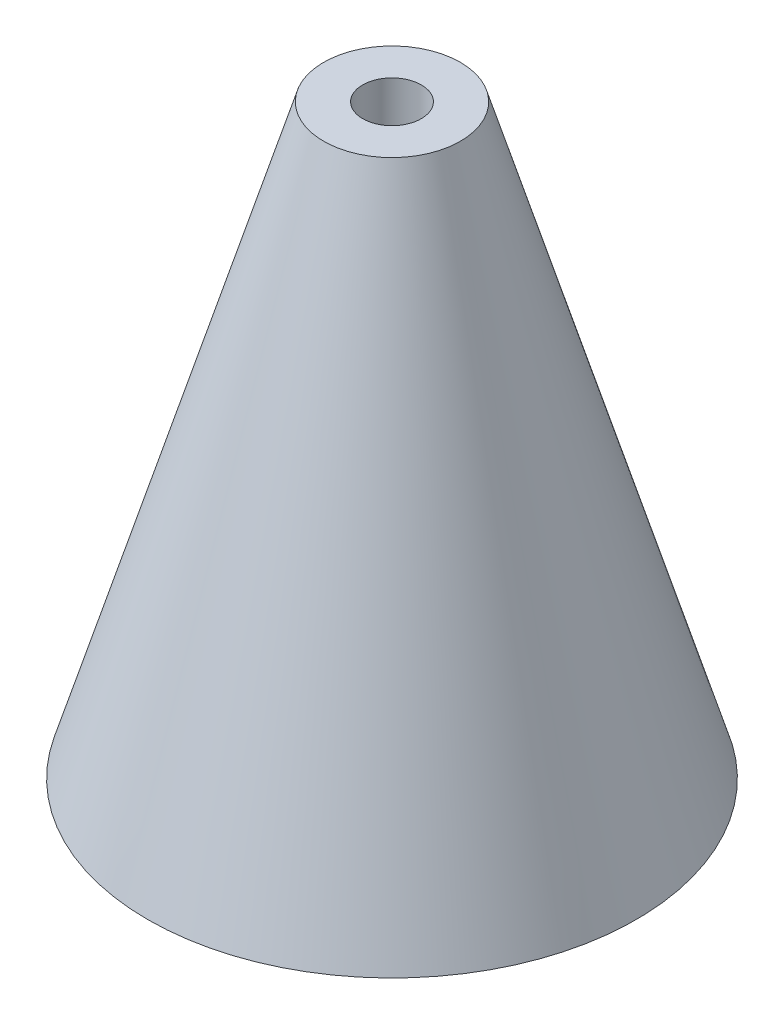
ISO-10303-21;
HEADER;
FILE_DESCRIPTION(('STEP AP214'),'2;1');
FILE_NAME('part.step','',(''),(''),'','','');
FILE_SCHEMA(('AUTOMOTIVE_DESIGN { 1 0 10303 214 1 1 1 1 }'));
ENDSEC;
DATA;
#1=APPLICATION_CONTEXT('core data for automotive mechanical design processes');
#2=APPLICATION_PROTOCOL_DEFINITION('international standard','automotive_design',2000,#1);
#3=PRODUCT_CONTEXT('',#1,'mechanical');
#4=PRODUCT('Part','Part','',(#3));
#5=PRODUCT_RELATED_PRODUCT_CATEGORY('part','',(#4));
#6=PRODUCT_DEFINITION_FORMATION('','',#4);
#7=PRODUCT_DEFINITION_CONTEXT('part definition',#1,'design');
#8=PRODUCT_DEFINITION('design','',#6,#7);
#9=PRODUCT_DEFINITION_SHAPE('','',#8);
#10=(LENGTH_UNIT() NAMED_UNIT(*) SI_UNIT(.MILLI.,.METRE.));
#11=(NAMED_UNIT(*) PLANE_ANGLE_UNIT() SI_UNIT($,.RADIAN.));
#12=(NAMED_UNIT(*) SI_UNIT($,.STERADIAN.) SOLID_ANGLE_UNIT());
#13=UNCERTAINTY_MEASURE_WITH_UNIT(LENGTH_MEASURE(1.E-05),#10,'distance_accuracy_value','');
#14=(GEOMETRIC_REPRESENTATION_CONTEXT(3) GLOBAL_UNCERTAINTY_ASSIGNED_CONTEXT((#13)) GLOBAL_UNIT_ASSIGNED_CONTEXT((#10,
#11,#12)) REPRESENTATION_CONTEXT('',''));
#15=CARTESIAN_POINT('',(0.,0.,0.));
#16=DIRECTION('',(0.,0.,1.));
#17=DIRECTION('',(1.,0.,0.));
#18=AXIS2_PLACEMENT_3D('',#15,#16,#17);
#19=CARTESIAN_POINT('',(3.,60.,0.));
#20=DIRECTION('',(0.,-1.,0.));
#21=DIRECTION('',(0.,0.,-1.));
#22=AXIS2_PLACEMENT_3D('',#19,#20,#21);
#23=PLANE('',#22);
#24=CARTESIAN_POINT('',(0.,60.,0.));
#25=DIRECTION('',(0.,1.,0.));
#26=DIRECTION('',(0.,0.,1.));
#27=AXIS2_PLACEMENT_3D('',#24,#25,#26);
#28=CIRCLE('',#27,3.);
#29=CARTESIAN_POINT('',(0.,60.,3.));
#30=VERTEX_POINT('',#29);
#31=EDGE_CURVE('E47',#30,#30,#28,.T.);
#32=ORIENTED_EDGE('',*,*,#31,.F.);
#33=EDGE_LOOP('',(#32));
#34=FACE_BOUND('',#33,.T.);
#35=CARTESIAN_POINT('',(0.,60.,0.));
#36=DIRECTION('',(0.,1.,0.));
#37=DIRECTION('',(0.,0.,1.));
#38=AXIS2_PLACEMENT_3D('',#35,#36,#37);
#39=CIRCLE('',#38,7.);
#40=CARTESIAN_POINT('',(0.,60.,-7.));
#41=VERTEX_POINT('',#40);
#42=EDGE_CURVE('E10',#41,#41,#39,.T.);
#43=ORIENTED_EDGE('',*,*,#42,.T.);
#44=EDGE_LOOP('',(#43));
#45=FACE_BOUND('',#44,.T.);
#46=ADVANCED_FACE('F33',(#34,#45),#23,.F.);
#47=CARTESIAN_POINT('',(0.,0.,0.));
#48=DIRECTION('',(0.,-1.,0.));
#49=DIRECTION('',(0.,0.,-1.));
#50=AXIS2_PLACEMENT_3D('',#47,#48,#49);
#51=CONICAL_SURFACE('',#50,25.,0.291456794477867);
#52=CARTESIAN_POINT('',(0.,0.,0.));
#53=DIRECTION('',(0.,1.,0.));
#54=DIRECTION('',(0.,0.,1.));
#55=AXIS2_PLACEMENT_3D('',#52,#53,#54);
#56=CIRCLE('',#55,25.);
#57=CARTESIAN_POINT('',(0.,0.,-25.));
#58=VERTEX_POINT('',#57);
#59=EDGE_CURVE('E39',#58,#58,#56,.T.);
#60=CARTESIAN_POINT('',(0.,60.,-7.));
#61=CARTESIAN_POINT('',(0.,59.375,-7.1875));
#62=CARTESIAN_POINT('',(0.,58.75,-7.375));
#63=CARTESIAN_POINT('',(0.,57.5,-7.75));
#64=CARTESIAN_POINT('',(0.,56.875,-7.9375));
#65=CARTESIAN_POINT('',(0.,55.625,-8.3125));
#66=CARTESIAN_POINT('',(0.,55.,-8.5));
#67=CARTESIAN_POINT('',(0.,53.75,-8.875));
#68=CARTESIAN_POINT('',(0.,53.125,-9.0625));
#69=CARTESIAN_POINT('',(0.,51.875,-9.4375));
#70=CARTESIAN_POINT('',(0.,51.25,-9.625));
#71=CARTESIAN_POINT('',(0.,50.,-10.));
#72=CARTESIAN_POINT('',(0.,49.375,-10.1875));
#73=CARTESIAN_POINT('',(0.,48.125,-10.5625));
#74=CARTESIAN_POINT('',(0.,47.5,-10.75));
#75=CARTESIAN_POINT('',(0.,46.25,-11.125));
#76=CARTESIAN_POINT('',(0.,45.625,-11.3125));
#77=CARTESIAN_POINT('',(0.,44.375,-11.6875));
#78=CARTESIAN_POINT('',(0.,43.75,-11.875));
#79=CARTESIAN_POINT('',(0.,42.5,-12.25));
#80=CARTESIAN_POINT('',(0.,41.875,-12.4375));
#81=CARTESIAN_POINT('',(0.,40.625,-12.8125));
#82=CARTESIAN_POINT('',(0.,40.,-13.));
#83=CARTESIAN_POINT('',(0.,38.75,-13.375));
#84=CARTESIAN_POINT('',(0.,38.125,-13.5625));
#85=CARTESIAN_POINT('',(0.,36.875,-13.9375));
#86=CARTESIAN_POINT('',(0.,36.25,-14.125));
#87=CARTESIAN_POINT('',(0.,35.,-14.5));
#88=CARTESIAN_POINT('',(0.,34.375,-14.6875));
#89=CARTESIAN_POINT('',(0.,33.125,-15.0625));
#90=CARTESIAN_POINT('',(0.,32.5,-15.25));
#91=CARTESIAN_POINT('',(0.,31.25,-15.625));
#92=CARTESIAN_POINT('',(0.,30.625,-15.8125));
#93=CARTESIAN_POINT('',(0.,29.375,-16.1875));
#94=CARTESIAN_POINT('',(0.,28.75,-16.375));
#95=CARTESIAN_POINT('',(0.,27.5,-16.75));
#96=CARTESIAN_POINT('',(0.,26.875,-16.9375));
#97=CARTESIAN_POINT('',(0.,25.625,-17.3125));
#98=CARTESIAN_POINT('',(0.,25.,-17.5));
#99=CARTESIAN_POINT('',(0.,23.75,-17.875));
#100=CARTESIAN_POINT('',(0.,23.125,-18.0625));
#101=CARTESIAN_POINT('',(0.,21.875,-18.4375));
#102=CARTESIAN_POINT('',(0.,21.25,-18.625));
#103=CARTESIAN_POINT('',(0.,20.,-19.));
#104=CARTESIAN_POINT('',(0.,19.375,-19.1875));
#105=CARTESIAN_POINT('',(0.,18.125,-19.5625));
#106=CARTESIAN_POINT('',(0.,17.5,-19.75));
#107=CARTESIAN_POINT('',(0.,16.25,-20.125));
#108=CARTESIAN_POINT('',(0.,15.625,-20.3125));
#109=CARTESIAN_POINT('',(0.,14.375,-20.6875));
#110=CARTESIAN_POINT('',(0.,13.75,-20.875));
#111=CARTESIAN_POINT('',(0.,12.5,-21.25));
#112=CARTESIAN_POINT('',(0.,11.875,-21.4375));
#113=CARTESIAN_POINT('',(0.,10.625,-21.8125));
#114=CARTESIAN_POINT('',(0.,10.,-22.));
#115=CARTESIAN_POINT('',(0.,8.75000000000001,-22.375));
#116=CARTESIAN_POINT('',(0.,8.12500000000001,-22.5625));
#117=CARTESIAN_POINT('',(0.,6.87500000000001,-22.9375));
#118=CARTESIAN_POINT('',(0.,6.25000000000001,-23.125));
#119=CARTESIAN_POINT('',(0.,5.00000000000001,-23.5));
#120=CARTESIAN_POINT('',(0.,4.37500000000001,-23.6875));
#121=CARTESIAN_POINT('',(0.,3.12500000000001,-24.0625));
#122=CARTESIAN_POINT('',(0.,2.50000000000001,-24.25));
#123=CARTESIAN_POINT('',(0.,1.25000000000001,-24.625));
#124=CARTESIAN_POINT('',(0.,0.625000000000011,-24.8125));
#125=CARTESIAN_POINT('',(0.,0.,-25.));
#126=B_SPLINE_CURVE_WITH_KNOTS('',3,(#60,#61,#62,#63,#64,#65,#66,#67,#68,#69,#70,#71,#72,#73,
#74,#75,#76,#77,#78,#79,#80,#81,#82,#83,#84,#85,#86,#87,#88,#89,#90,#91,#92,#93,#94,#95,#96,#97,
#98,#99,#100,#101,#102,#103,#104,#105,#106,#107,#108,#109,#110,#111,#112,#113,#114,#115,#116,
#117,#118,#119,#120,#121,#122,#123,#124,#125),.UNSPECIFIED.,.F.,.F.,(4,2,2,2,2,2,2,2,2,2,2,2,2,
2,2,2,2,2,2,2,2,2,2,2,2,2,2,2,2,2,2,2,4),(0.,1.95755747042073,3.91511494084145,5.87267241126218,
7.83022988168291,9.78778735210364,11.7453448225244,13.7029022929451,15.6604597633658,
17.6180172337865,19.5755747042073,21.533132174628,23.4906896450487,25.4482471154695,
27.4058045858902,29.3633620563109,31.3209195267316,33.2784769971524,35.2360344675731,
37.1935919379938,39.1511494084145,41.1087068788353,43.066264349256,45.0238218196767,
46.9813792900974,48.9389367605182,50.8964942309389,52.8540517013596,54.8116091717804,
56.7691666422011,58.7267241126218,60.6842815830425,62.6418390534633),.UNSPECIFIED.);
#127=EDGE_CURVE('BSEAM56',#41,#58,#126,.T.);
#128=ORIENTED_EDGE('',*,*,#42,.F.);
#129=ORIENTED_EDGE('',*,*,#59,.T.);
#130=ORIENTED_EDGE('',*,*,#127,.T.);
#131=ORIENTED_EDGE('',*,*,#127,.F.);
#132=EDGE_LOOP('',(#128,#130,#129,#131));
#133=FACE_BOUND('',#132,.T.);
#134=ADVANCED_FACE('F56',(#133),#51,.T.);
#135=CARTESIAN_POINT('',(3.00000000000001,0.,0.));
#136=DIRECTION('',(0.,1.,0.));
#137=DIRECTION('',(0.,0.,1.));
#138=AXIS2_PLACEMENT_3D('',#135,#136,#137);
#139=PLANE('',#138);
#140=ORIENTED_EDGE('',*,*,#59,.F.);
#141=EDGE_LOOP('',(#140));
#142=FACE_BOUND('',#141,.T.);
#143=CARTESIAN_POINT('',(0.,0.,0.));
#144=DIRECTION('',(0.,1.,0.));
#145=DIRECTION('',(0.,0.,1.));
#146=AXIS2_PLACEMENT_3D('',#143,#144,#145);
#147=CIRCLE('',#146,3.00000000000001);
#148=CARTESIAN_POINT('',(0.,0.,3.00000000000001));
#149=VERTEX_POINT('',#148);
#150=EDGE_CURVE('E43',#149,#149,#147,.T.);
#151=ORIENTED_EDGE('',*,*,#150,.T.);
#152=EDGE_LOOP('',(#151));
#153=FACE_BOUND('',#152,.T.);
#154=ADVANCED_FACE('F60',(#142,#153),#139,.F.);
#155=CARTESIAN_POINT('',(0.,0.,0.));
#156=DIRECTION('',(0.,1.,0.));
#157=DIRECTION('',(0.,0.,1.));
#158=AXIS2_PLACEMENT_3D('',#155,#156,#157);
#159=CYLINDRICAL_SURFACE('',#158,3.);
#160=ORIENTED_EDGE('',*,*,#150,.F.);
#161=EDGE_LOOP('',(#160));
#162=FACE_BOUND('',#161,.T.);
#163=ORIENTED_EDGE('',*,*,#31,.T.);
#164=EDGE_LOOP('',(#163));
#165=FACE_BOUND('',#164,.T.);
#166=ADVANCED_FACE('F53',(#162,#165),#159,.F.);
#167=CLOSED_SHELL('',(#46,#134,#154,#166));
#168=MANIFOLD_SOLID_BREP('B2',#167);
#169=ADVANCED_BREP_SHAPE_REPRESENTATION('',(#18,#168),#14);
#170=SHAPE_DEFINITION_REPRESENTATION(#9,#169);
ENDSEC;
END-ISO-10303-21;
